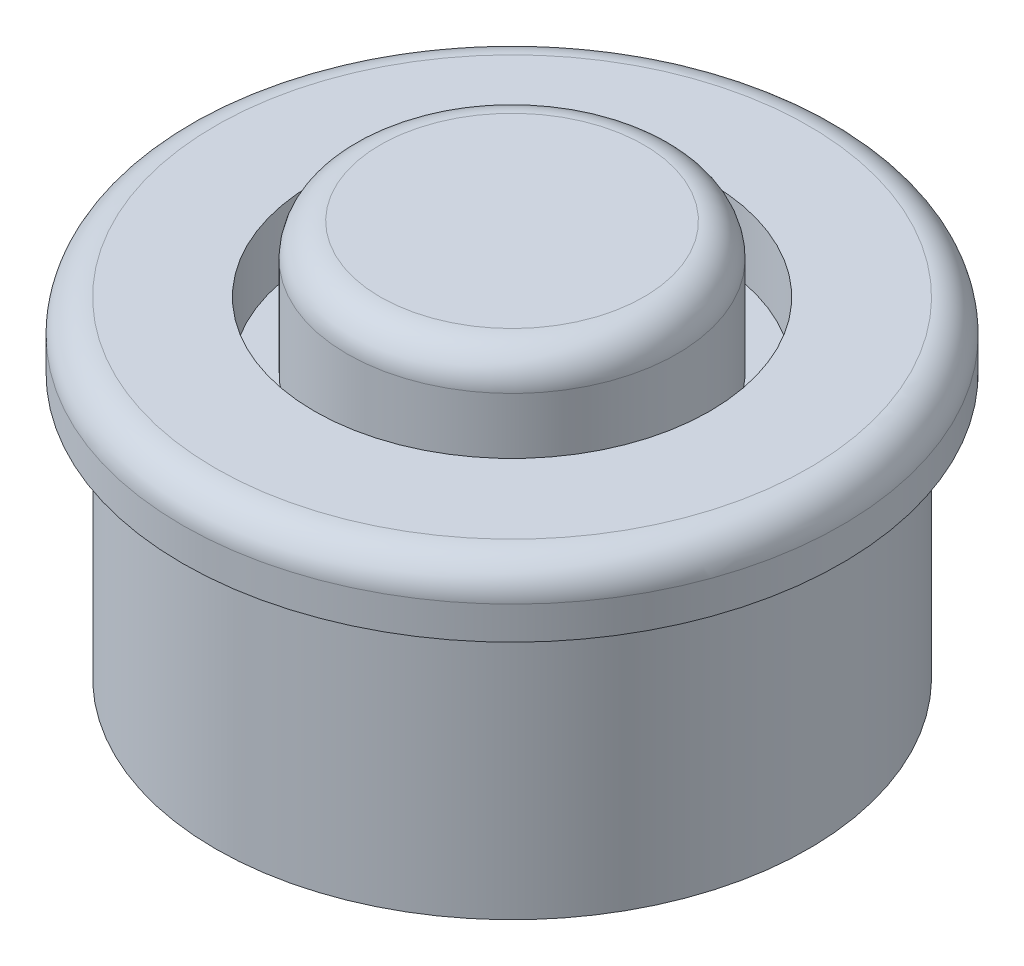
ISO-10303-21;
HEADER;
FILE_DESCRIPTION(('STEP AP214'),'2;1');
FILE_NAME('part.step','',(''),(''),'','','');
FILE_SCHEMA(('AUTOMOTIVE_DESIGN { 1 0 10303 214 1 1 1 1 }'));
ENDSEC;
DATA;
#1=APPLICATION_CONTEXT('core data for automotive mechanical design processes');
#2=APPLICATION_PROTOCOL_DEFINITION('international standard','automotive_design',2000,#1);
#3=PRODUCT_CONTEXT('',#1,'mechanical');
#4=PRODUCT('Part','Part','',(#3));
#5=PRODUCT_RELATED_PRODUCT_CATEGORY('part','',(#4));
#6=PRODUCT_DEFINITION_FORMATION('','',#4);
#7=PRODUCT_DEFINITION_CONTEXT('part definition',#1,'design');
#8=PRODUCT_DEFINITION('design','',#6,#7);
#9=PRODUCT_DEFINITION_SHAPE('','',#8);
#10=(LENGTH_UNIT() NAMED_UNIT(*) SI_UNIT(.MILLI.,.METRE.));
#11=(NAMED_UNIT(*) PLANE_ANGLE_UNIT() SI_UNIT($,.RADIAN.));
#12=(NAMED_UNIT(*) SI_UNIT($,.STERADIAN.) SOLID_ANGLE_UNIT());
#13=UNCERTAINTY_MEASURE_WITH_UNIT(LENGTH_MEASURE(1.E-05),#10,'distance_accuracy_value','');
#14=(GEOMETRIC_REPRESENTATION_CONTEXT(3) GLOBAL_UNCERTAINTY_ASSIGNED_CONTEXT((#13)) GLOBAL_UNIT_ASSIGNED_CONTEXT((#10,
#11,#12)) REPRESENTATION_CONTEXT('',''));
#15=CARTESIAN_POINT('',(0.,0.,0.));
#16=DIRECTION('',(0.,0.,1.));
#17=DIRECTION('',(1.,0.,0.));
#18=AXIS2_PLACEMENT_3D('',#15,#16,#17);
#19=CARTESIAN_POINT('',(0.,2.,0.));
#20=DIRECTION('',(0.,1.,0.));
#21=DIRECTION('',(0.,0.,1.));
#22=AXIS2_PLACEMENT_3D('',#19,#20,#21);
#23=PLANE('',#22);
#24=CARTESIAN_POINT('',(0.,2.,0.));
#25=DIRECTION('',(0.,1.,0.));
#26=DIRECTION('',(0.,0.,1.));
#27=AXIS2_PLACEMENT_3D('',#24,#25,#26);
#28=CIRCLE('',#27,9.);
#29=CARTESIAN_POINT('',(0.,2.,9.));
#30=VERTEX_POINT('',#29);
#31=EDGE_CURVE('E44',#30,#30,#28,.T.);
#32=ORIENTED_EDGE('',*,*,#31,.T.);
#33=EDGE_LOOP('',(#32));
#34=FACE_BOUND('',#33,.T.);
#35=CARTESIAN_POINT('',(0.,2.,0.));
#36=DIRECTION('',(0.,1.,0.));
#37=DIRECTION('',(0.,0.,1.));
#38=AXIS2_PLACEMENT_3D('',#35,#36,#37);
#39=CIRCLE('',#38,6.);
#40=CARTESIAN_POINT('',(0.,2.,6.));
#41=VERTEX_POINT('',#40);
#42=EDGE_CURVE('E60',#41,#41,#39,.T.);
#43=ORIENTED_EDGE('',*,*,#42,.F.);
#44=EDGE_LOOP('',(#43));
#45=FACE_BOUND('',#44,.T.);
#46=ADVANCED_FACE('F37',(#34,#45),#23,.T.);
#47=CARTESIAN_POINT('',(0.,0.,0.));
#48=DIRECTION('',(0.,1.,0.));
#49=DIRECTION('',(0.,0.,1.));
#50=AXIS2_PLACEMENT_3D('',#47,#48,#49);
#51=PLANE('',#50);
#52=CARTESIAN_POINT('',(0.,0.,0.));
#53=DIRECTION('',(0.,1.,0.));
#54=DIRECTION('',(0.,0.,1.));
#55=AXIS2_PLACEMENT_3D('',#52,#53,#54);
#56=CIRCLE('',#55,9.);
#57=CARTESIAN_POINT('',(0.,0.,9.));
#58=VERTEX_POINT('',#57);
#59=EDGE_CURVE('E67',#58,#58,#56,.T.);
#60=ORIENTED_EDGE('',*,*,#59,.T.);
#61=EDGE_LOOP('',(#60));
#62=FACE_BOUND('',#61,.T.);
#63=CARTESIAN_POINT('',(0.,0.,0.));
#64=DIRECTION('',(0.,1.,0.));
#65=DIRECTION('',(0.,0.,1.));
#66=AXIS2_PLACEMENT_3D('',#63,#64,#65);
#67=CIRCLE('',#66,10.);
#68=CARTESIAN_POINT('',(0.,0.,10.));
#69=VERTEX_POINT('',#68);
#70=EDGE_CURVE('E57',#69,#69,#67,.T.);
#71=ORIENTED_EDGE('',*,*,#70,.F.);
#72=EDGE_LOOP('',(#71));
#73=FACE_BOUND('',#72,.T.);
#74=ADVANCED_FACE('F98',(#62,#73),#51,.F.);
#75=CARTESIAN_POINT('',(0.,2.,0.));
#76=DIRECTION('',(0.,-1.,0.));
#77=DIRECTION('',(0.,0.,-1.));
#78=AXIS2_PLACEMENT_3D('',#75,#76,#77);
#79=CYLINDRICAL_SURFACE('',#78,10.);
#80=CARTESIAN_POINT('',(0.,1.,0.));
#81=DIRECTION('',(0.,1.,0.));
#82=DIRECTION('',(0.,0.,1.));
#83=AXIS2_PLACEMENT_3D('',#80,#81,#82);
#84=CIRCLE('',#83,10.);
#85=CARTESIAN_POINT('',(0.,1.,10.));
#86=VERTEX_POINT('',#85);
#87=EDGE_CURVE('E10',#86,#86,#84,.F.);
#88=ORIENTED_EDGE('',*,*,#87,.T.);
#89=EDGE_LOOP('',(#88));
#90=FACE_BOUND('',#89,.T.);
#91=ORIENTED_EDGE('',*,*,#70,.T.);
#92=EDGE_LOOP('',(#91));
#93=FACE_BOUND('',#92,.T.);
#94=ADVANCED_FACE('F88',(#90,#93),#79,.T.);
#95=CARTESIAN_POINT('',(0.,2.,0.));
#96=DIRECTION('',(0.,-1.,0.));
#97=DIRECTION('',(0.,0.,-1.));
#98=AXIS2_PLACEMENT_3D('',#95,#96,#97);
#99=CYLINDRICAL_SURFACE('',#98,6.);
#100=ORIENTED_EDGE('',*,*,#42,.T.);
#101=EDGE_LOOP('',(#100));
#102=FACE_BOUND('',#101,.T.);
#103=CARTESIAN_POINT('',(0.,0.,0.));
#104=DIRECTION('',(0.,1.,0.));
#105=DIRECTION('',(0.,0.,1.));
#106=AXIS2_PLACEMENT_3D('',#103,#104,#105);
#107=CIRCLE('',#106,6.);
#108=CARTESIAN_POINT('',(0.,0.,6.));
#109=VERTEX_POINT('',#108);
#110=EDGE_CURVE('E61',#109,#109,#107,.T.);
#111=ORIENTED_EDGE('',*,*,#110,.F.);
#112=EDGE_LOOP('',(#111));
#113=FACE_BOUND('',#112,.T.);
#114=ADVANCED_FACE('F85',(#102,#113),#99,.F.);
#115=CARTESIAN_POINT('',(0.,-8.,0.));
#116=DIRECTION('',(0.,1.,0.));
#117=DIRECTION('',(0.,0.,1.));
#118=AXIS2_PLACEMENT_3D('',#115,#116,#117);
#119=PLANE('',#118);
#120=CARTESIAN_POINT('',(0.,-8.,0.));
#121=DIRECTION('',(0.,1.,0.));
#122=DIRECTION('',(0.,0.,1.));
#123=AXIS2_PLACEMENT_3D('',#120,#121,#122);
#124=CIRCLE('',#123,9.);
#125=CARTESIAN_POINT('',(0.,-8.,9.));
#126=VERTEX_POINT('',#125);
#127=EDGE_CURVE('E64',#126,#126,#124,.T.);
#128=ORIENTED_EDGE('',*,*,#127,.F.);
#129=EDGE_LOOP('',(#128));
#130=FACE_BOUND('',#129,.T.);
#131=ADVANCED_FACE('F87',(#130),#119,.F.);
#132=CARTESIAN_POINT('',(0.,-8.,0.));
#133=DIRECTION('',(0.,1.,0.));
#134=DIRECTION('',(0.,0.,1.));
#135=AXIS2_PLACEMENT_3D('',#132,#133,#134);
#136=CYLINDRICAL_SURFACE('',#135,9.);
#137=ORIENTED_EDGE('',*,*,#127,.T.);
#138=EDGE_LOOP('',(#137));
#139=FACE_BOUND('',#138,.T.);
#140=ORIENTED_EDGE('',*,*,#59,.F.);
#141=EDGE_LOOP('',(#140));
#142=FACE_BOUND('',#141,.T.);
#143=ADVANCED_FACE('F81',(#139,#142),#136,.T.);
#144=CARTESIAN_POINT('',(0.,0.,0.));
#145=DIRECTION('',(0.,1.,0.));
#146=DIRECTION('',(0.,0.,1.));
#147=AXIS2_PLACEMENT_3D('',#144,#145,#146);
#148=PLANE('',#147);
#149=CARTESIAN_POINT('',(0.,0.,0.));
#150=DIRECTION('',(0.,1.,0.));
#151=DIRECTION('',(0.,0.,1.));
#152=AXIS2_PLACEMENT_3D('',#149,#150,#151);
#153=CIRCLE('',#152,5.);
#154=CARTESIAN_POINT('',(0.,0.,5.));
#155=VERTEX_POINT('',#154);
#156=EDGE_CURVE('E70',#155,#155,#153,.T.);
#157=ORIENTED_EDGE('',*,*,#156,.F.);
#158=EDGE_LOOP('',(#157));
#159=FACE_BOUND('',#158,.T.);
#160=ORIENTED_EDGE('',*,*,#110,.T.);
#161=EDGE_LOOP('',(#160));
#162=FACE_BOUND('',#161,.T.);
#163=ADVANCED_FACE('F78',(#159,#162),#148,.T.);
#164=CARTESIAN_POINT('',(0.,4.,0.));
#165=DIRECTION('',(0.,-1.,0.));
#166=DIRECTION('',(0.,0.,-1.));
#167=AXIS2_PLACEMENT_3D('',#164,#165,#166);
#168=CYLINDRICAL_SURFACE('',#167,5.);
#169=CARTESIAN_POINT('',(0.,3.,0.));
#170=DIRECTION('',(0.,1.,0.));
#171=DIRECTION('',(0.,0.,1.));
#172=AXIS2_PLACEMENT_3D('',#169,#170,#171);
#173=CIRCLE('',#172,5.);
#174=CARTESIAN_POINT('',(0.,3.,5.));
#175=VERTEX_POINT('',#174);
#176=EDGE_CURVE('E48',#175,#175,#173,.F.);
#177=ORIENTED_EDGE('',*,*,#176,.T.);
#178=EDGE_LOOP('',(#177));
#179=FACE_BOUND('',#178,.T.);
#180=ORIENTED_EDGE('',*,*,#156,.T.);
#181=EDGE_LOOP('',(#180));
#182=FACE_BOUND('',#181,.T.);
#183=ADVANCED_FACE('F76',(#179,#182),#168,.T.);
#184=CARTESIAN_POINT('',(0.,4.,0.));
#185=DIRECTION('',(0.,1.,0.));
#186=DIRECTION('',(0.,0.,1.));
#187=AXIS2_PLACEMENT_3D('',#184,#185,#186);
#188=PLANE('',#187);
#189=CARTESIAN_POINT('',(0.,4.,0.));
#190=DIRECTION('',(0.,1.,0.));
#191=DIRECTION('',(0.,0.,1.));
#192=AXIS2_PLACEMENT_3D('',#189,#190,#191);
#193=CIRCLE('',#192,4.);
#194=CARTESIAN_POINT('',(0.,4.,4.));
#195=VERTEX_POINT('',#194);
#196=EDGE_CURVE('E52',#195,#195,#193,.T.);
#197=ORIENTED_EDGE('',*,*,#196,.T.);
#198=EDGE_LOOP('',(#197));
#199=FACE_BOUND('',#198,.T.);
#200=ADVANCED_FACE('F110',(#199),#188,.T.);
#201=CARTESIAN_POINT('',(0.,3.,0.));
#202=DIRECTION('',(0.,1.,0.));
#203=DIRECTION('',(0.,0.,1.));
#204=AXIS2_PLACEMENT_3D('',#201,#202,#203);
#205=TOROIDAL_SURFACE('',#204,4.,1.);
#206=ORIENTED_EDGE('',*,*,#176,.F.);
#207=EDGE_LOOP('',(#206));
#208=FACE_BOUND('',#207,.T.);
#209=ORIENTED_EDGE('',*,*,#196,.F.);
#210=EDGE_LOOP('',(#209));
#211=FACE_BOUND('',#210,.T.);
#212=ADVANCED_FACE('F108',(#208,#211),#205,.T.);
#213=CARTESIAN_POINT('',(0.,1.,0.));
#214=DIRECTION('',(0.,1.,0.));
#215=DIRECTION('',(0.,0.,1.));
#216=AXIS2_PLACEMENT_3D('',#213,#214,#215);
#217=TOROIDAL_SURFACE('',#216,9.,1.);
#218=ORIENTED_EDGE('',*,*,#87,.F.);
#219=EDGE_LOOP('',(#218));
#220=FACE_BOUND('',#219,.T.);
#221=ORIENTED_EDGE('',*,*,#31,.F.);
#222=EDGE_LOOP('',(#221));
#223=FACE_BOUND('',#222,.T.);
#224=ADVANCED_FACE('F39',(#220,#223),#217,.T.);
#225=CLOSED_SHELL('',(#46,#74,#94,#114,#131,#143,#163,#183,#200,#212,#224));
#226=MANIFOLD_SOLID_BREP('B2',#225);
#227=ADVANCED_BREP_SHAPE_REPRESENTATION('',(#18,#226),#14);
#228=SHAPE_DEFINITION_REPRESENTATION(#9,#227);
ENDSEC;
END-ISO-10303-21;
